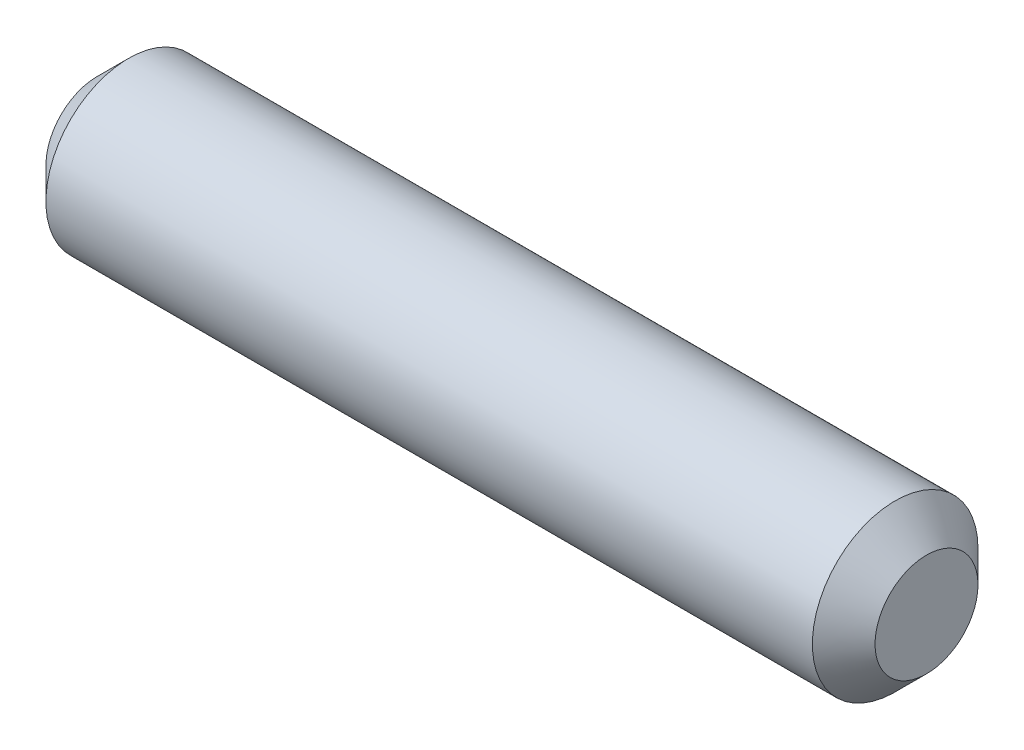
ISO-10303-21;
HEADER;
FILE_DESCRIPTION(('STEP AP214'),'2;1');
FILE_NAME('part.step','',(''),(''),'','','');
FILE_SCHEMA(('AUTOMOTIVE_DESIGN { 1 0 10303 214 1 1 1 1 }'));
ENDSEC;
DATA;
#1=APPLICATION_CONTEXT('core data for automotive mechanical design processes');
#2=APPLICATION_PROTOCOL_DEFINITION('international standard','automotive_design',2000,#1);
#3=PRODUCT_CONTEXT('',#1,'mechanical');
#4=PRODUCT('Part','Part','',(#3));
#5=PRODUCT_RELATED_PRODUCT_CATEGORY('part','',(#4));
#6=PRODUCT_DEFINITION_FORMATION('','',#4);
#7=PRODUCT_DEFINITION_CONTEXT('part definition',#1,'design');
#8=PRODUCT_DEFINITION('design','',#6,#7);
#9=PRODUCT_DEFINITION_SHAPE('','',#8);
#10=(LENGTH_UNIT() NAMED_UNIT(*) SI_UNIT(.MILLI.,.METRE.));
#11=(NAMED_UNIT(*) PLANE_ANGLE_UNIT() SI_UNIT($,.RADIAN.));
#12=(NAMED_UNIT(*) SI_UNIT($,.STERADIAN.) SOLID_ANGLE_UNIT());
#13=UNCERTAINTY_MEASURE_WITH_UNIT(LENGTH_MEASURE(1.E-05),#10,'distance_accuracy_value','');
#14=(GEOMETRIC_REPRESENTATION_CONTEXT(3) GLOBAL_UNCERTAINTY_ASSIGNED_CONTEXT((#13)) GLOBAL_UNIT_ASSIGNED_CONTEXT((#10,
#11,#12)) REPRESENTATION_CONTEXT('',''));
#15=CARTESIAN_POINT('',(0.,0.,0.));
#16=DIRECTION('',(0.,0.,1.));
#17=DIRECTION('',(1.,0.,0.));
#18=AXIS2_PLACEMENT_3D('',#15,#16,#17);
#19=CARTESIAN_POINT('',(7.935,0.,0.));
#20=DIRECTION('',(-1.,0.,0.));
#21=DIRECTION('',(0.,0.,1.));
#22=AXIS2_PLACEMENT_3D('',#19,#20,#21);
#23=CYLINDRICAL_SURFACE('',#22,1.585);
#24=CARTESIAN_POINT('',(7.335,0.,0.));
#25=DIRECTION('',(1.,0.,0.));
#26=DIRECTION('',(0.,0.,-1.));
#27=AXIS2_PLACEMENT_3D('',#24,#25,#26);
#28=CIRCLE('',#27,1.585);
#29=CARTESIAN_POINT('',(7.335,0.,-1.585));
#30=VERTEX_POINT('',#29);
#31=EDGE_CURVE('E41',#30,#30,#28,.F.);
#32=ORIENTED_EDGE('',*,*,#31,.T.);
#33=EDGE_LOOP('',(#32));
#34=FACE_BOUND('',#33,.T.);
#35=CARTESIAN_POINT('',(-7.335,0.,0.));
#36=DIRECTION('',(1.,0.,0.));
#37=DIRECTION('',(0.,0.,-1.));
#38=AXIS2_PLACEMENT_3D('',#35,#36,#37);
#39=CIRCLE('',#38,1.585);
#40=CARTESIAN_POINT('',(-7.335,0.,-1.585));
#41=VERTEX_POINT('',#40);
#42=EDGE_CURVE('E45',#41,#41,#39,.T.);
#43=ORIENTED_EDGE('',*,*,#42,.T.);
#44=EDGE_LOOP('',(#43));
#45=FACE_BOUND('',#44,.T.);
#46=ADVANCED_FACE('F33',(#34,#45),#23,.T.);
#47=CARTESIAN_POINT('',(7.935,0.,0.));
#48=DIRECTION('',(1.,0.,0.));
#49=DIRECTION('',(0.,0.,-1.));
#50=AXIS2_PLACEMENT_3D('',#47,#48,#49);
#51=PLANE('',#50);
#52=CARTESIAN_POINT('',(7.935,0.,0.));
#53=DIRECTION('',(1.,0.,0.));
#54=DIRECTION('',(0.,0.,-1.));
#55=AXIS2_PLACEMENT_3D('',#52,#53,#54);
#56=CIRCLE('',#55,0.984999999999998);
#57=CARTESIAN_POINT('',(7.935,0.,-0.984999999999998));
#58=VERTEX_POINT('',#57);
#59=EDGE_CURVE('E49',#58,#58,#56,.T.);
#60=ORIENTED_EDGE('',*,*,#59,.T.);
#61=EDGE_LOOP('',(#60));
#62=FACE_BOUND('',#61,.T.);
#63=ADVANCED_FACE('F55',(#62),#51,.T.);
#64=CARTESIAN_POINT('',(-7.935,0.,0.));
#65=DIRECTION('',(1.,0.,0.));
#66=DIRECTION('',(0.,0.,-1.));
#67=AXIS2_PLACEMENT_3D('',#64,#65,#66);
#68=PLANE('',#67);
#69=CARTESIAN_POINT('',(-7.935,0.,0.));
#70=DIRECTION('',(1.,0.,0.));
#71=DIRECTION('',(0.,0.,-1.));
#72=AXIS2_PLACEMENT_3D('',#69,#70,#71);
#73=CIRCLE('',#72,0.984999999999998);
#74=CARTESIAN_POINT('',(-7.935,0.,-0.984999999999998));
#75=VERTEX_POINT('',#74);
#76=EDGE_CURVE('E10',#75,#75,#73,.F.);
#77=ORIENTED_EDGE('',*,*,#76,.T.);
#78=EDGE_LOOP('',(#77));
#79=FACE_BOUND('',#78,.T.);
#80=ADVANCED_FACE('F59',(#79),#68,.F.);
#81=CARTESIAN_POINT('',(7.935,0.,0.));
#82=DIRECTION('',(-1.,0.,0.));
#83=DIRECTION('',(0.,0.,1.));
#84=AXIS2_PLACEMENT_3D('',#81,#82,#83);
#85=CONICAL_SURFACE('',#84,0.984999999999998,0.785398163397447);
#86=ORIENTED_EDGE('',*,*,#31,.F.);
#87=EDGE_LOOP('',(#86));
#88=FACE_BOUND('',#87,.T.);
#89=ORIENTED_EDGE('',*,*,#59,.F.);
#90=EDGE_LOOP('',(#89));
#91=FACE_BOUND('',#90,.T.);
#92=ADVANCED_FACE('F57',(#88,#91),#85,.T.);
#93=CARTESIAN_POINT('',(-7.335,0.,0.));
#94=DIRECTION('',(1.,0.,0.));
#95=DIRECTION('',(0.,0.,-1.));
#96=AXIS2_PLACEMENT_3D('',#93,#94,#95);
#97=CONICAL_SURFACE('',#96,1.585,0.785398163397447);
#98=ORIENTED_EDGE('',*,*,#76,.F.);
#99=EDGE_LOOP('',(#98));
#100=FACE_BOUND('',#99,.T.);
#101=ORIENTED_EDGE('',*,*,#42,.F.);
#102=EDGE_LOOP('',(#101));
#103=FACE_BOUND('',#102,.T.);
#104=ADVANCED_FACE('F36',(#100,#103),#97,.T.);
#105=CLOSED_SHELL('',(#46,#63,#80,#92,#104));
#106=MANIFOLD_SOLID_BREP('B2',#105);
#107=ADVANCED_BREP_SHAPE_REPRESENTATION('',(#18,#106),#14);
#108=SHAPE_DEFINITION_REPRESENTATION(#9,#107);
ENDSEC;
END-ISO-10303-21;
